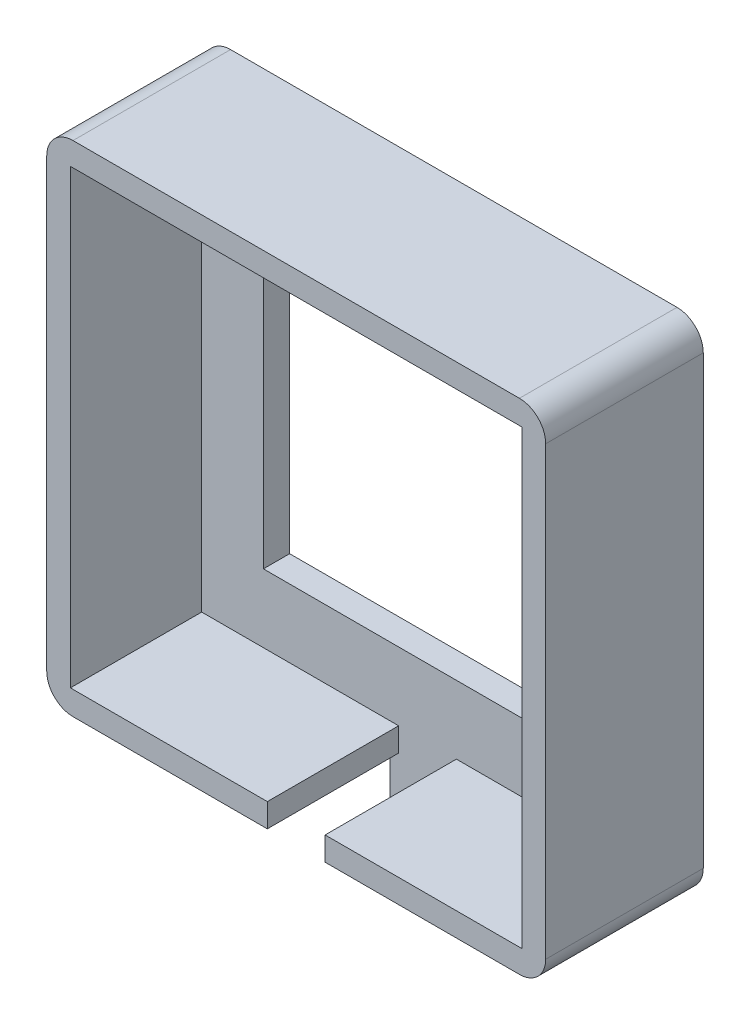
ISO-10303-21;
HEADER;
FILE_DESCRIPTION(('STEP AP214'),'2;1');
FILE_NAME('part.step','',(''),(''),'','','');
FILE_SCHEMA(('AUTOMOTIVE_DESIGN { 1 0 10303 214 1 1 1 1 }'));
ENDSEC;
DATA;
#1=APPLICATION_CONTEXT('core data for automotive mechanical design processes');
#2=APPLICATION_PROTOCOL_DEFINITION('international standard','automotive_design',2000,#1);
#3=PRODUCT_CONTEXT('',#1,'mechanical');
#4=PRODUCT('Part','Part','',(#3));
#5=PRODUCT_RELATED_PRODUCT_CATEGORY('part','',(#4));
#6=PRODUCT_DEFINITION_FORMATION('','',#4);
#7=PRODUCT_DEFINITION_CONTEXT('part definition',#1,'design');
#8=PRODUCT_DEFINITION('design','',#6,#7);
#9=PRODUCT_DEFINITION_SHAPE('','',#8);
#10=(LENGTH_UNIT() NAMED_UNIT(*) SI_UNIT(.MILLI.,.METRE.));
#11=(NAMED_UNIT(*) PLANE_ANGLE_UNIT() SI_UNIT($,.RADIAN.));
#12=(NAMED_UNIT(*) SI_UNIT($,.STERADIAN.) SOLID_ANGLE_UNIT());
#13=UNCERTAINTY_MEASURE_WITH_UNIT(LENGTH_MEASURE(1.E-05),#10,'distance_accuracy_value','');
#14=(GEOMETRIC_REPRESENTATION_CONTEXT(3) GLOBAL_UNCERTAINTY_ASSIGNED_CONTEXT((#13)) GLOBAL_UNIT_ASSIGNED_CONTEXT((#10,
#11,#12)) REPRESENTATION_CONTEXT('',''));
#15=CARTESIAN_POINT('',(0.,0.,0.));
#16=DIRECTION('',(0.,0.,1.));
#17=DIRECTION('',(1.,0.,0.));
#18=AXIS2_PLACEMENT_3D('',#15,#16,#17);
#19=CARTESIAN_POINT('',(-24.018947996006,-15.2573855243722,2.));
#20=DIRECTION('',(0.,1.,0.));
#21=DIRECTION('',(0.,0.,1.));
#22=AXIS2_PLACEMENT_3D('',#19,#20,#21);
#23=PLANE('',#22);
#24=DIRECTION('',(1.,0.,0.));
#25=VECTOR('',#24,1.);
#26=CARTESIAN_POINT('',(-2.14249889150364,-15.2573855243722,2.));
#27=LINE('',#26,#25);
#28=CARTESIAN_POINT('',(-2.81894799600603,-15.2573855243722,2.));
#29=VERTEX_POINT('',#28);
#30=CARTESIAN_POINT('',(-2.14249889150364,-15.2573855243722,2.));
#31=VERTEX_POINT('',#30);
#32=EDGE_CURVE('E50',#29,#31,#27,.T.);
#33=ORIENTED_EDGE('',*,*,#32,.T.);
#34=DIRECTION('',(0.,0.,-1.));
#35=VECTOR('',#34,1.);
#36=CARTESIAN_POINT('',(-2.14249889150364,-15.2573855243722,2.));
#37=LINE('',#36,#35);
#38=CARTESIAN_POINT('',(-2.14249889150364,-15.2573855243722,0.));
#39=VERTEX_POINT('',#38);
#40=EDGE_CURVE('E209',#31,#39,#37,.T.);
#41=ORIENTED_EDGE('',*,*,#40,.T.);
#42=DIRECTION('',(1.,0.,0.));
#43=VECTOR('',#42,1.);
#44=CARTESIAN_POINT('',(-24.018947996006,-15.2573855243722,0.));
#45=LINE('',#44,#43);
#46=CARTESIAN_POINT('',(11.981052003994,-15.2573855243722,0.));
#47=VERTEX_POINT('',#46);
#48=EDGE_CURVE('E405',#39,#47,#45,.T.);
#49=ORIENTED_EDGE('',*,*,#48,.T.);
#50=DIRECTION('',(0.,0.,-1.));
#51=VECTOR('',#50,1.);
#52=CARTESIAN_POINT('',(11.981052003994,-15.2573855243722,2.));
#53=LINE('',#52,#51);
#54=CARTESIAN_POINT('',(11.981052003994,-15.2573855243722,12.));
#55=VERTEX_POINT('',#54);
#56=EDGE_CURVE('E297',#47,#55,#53,.F.);
#57=ORIENTED_EDGE('',*,*,#56,.T.);
#58=DIRECTION('',(1.,0.,0.));
#59=VECTOR('',#58,1.);
#60=CARTESIAN_POINT('',(13.981052003994,-15.2573855243722,12.));
#61=LINE('',#60,#59);
#62=CARTESIAN_POINT('',(-2.81894799600603,-15.2573855243722,12.));
#63=VERTEX_POINT('',#62);
#64=EDGE_CURVE('E260',#63,#55,#61,.T.);
#65=ORIENTED_EDGE('',*,*,#64,.F.);
#66=DIRECTION('',(0.,0.,-1.));
#67=VECTOR('',#66,1.);
#68=CARTESIAN_POINT('',(-2.81894799600603,-15.2573855243722,12.));
#69=LINE('',#68,#67);
#70=EDGE_CURVE('E269',#63,#29,#69,.T.);
#71=ORIENTED_EDGE('',*,*,#70,.T.);
#72=EDGE_LOOP('',(#33,#41,#49,#57,#65,#71));
#73=FACE_BOUND('',#72,.T.);
#74=ADVANCED_FACE('F35',(#73),#23,.F.);
#75=CARTESIAN_POINT('',(0.,0.,2.));
#76=DIRECTION('',(0.,0.,1.));
#77=DIRECTION('',(1.,0.,0.));
#78=AXIS2_PLACEMENT_3D('',#75,#76,#77);
#79=PLANE('',#78);
#80=DIRECTION('',(0.,-1.,0.));
#81=VECTOR('',#80,1.);
#82=CARTESIAN_POINT('',(-2.81894799600603,-15.2573855243722,2.));
#83=LINE('',#82,#81);
#84=CARTESIAN_POINT('',(-2.81894799600604,-13.4573855243722,2.));
#85=VERTEX_POINT('',#84);
#86=EDGE_CURVE('E244',#85,#29,#83,.T.);
#87=ORIENTED_EDGE('',*,*,#86,.F.);
#88=DIRECTION('',(-1.,0.,0.));
#89=VECTOR('',#88,1.);
#90=CARTESIAN_POINT('',(-2.81894799600604,-13.4573855243722,2.));
#91=LINE('',#90,#89);
#92=CARTESIAN_POINT('',(12.181052003994,-13.4573855243722,2.));
#93=VERTEX_POINT('',#92);
#94=EDGE_CURVE('E282',#93,#85,#91,.T.);
#95=ORIENTED_EDGE('',*,*,#94,.F.);
#96=DIRECTION('',(0.,-1.,0.));
#97=VECTOR('',#96,1.);
#98=CARTESIAN_POINT('',(12.181052003994,-13.4573855243722,2.));
#99=LINE('',#98,#97);
#100=CARTESIAN_POINT('',(12.181052003994,20.9426144756278,2.));
#101=VERTEX_POINT('',#100);
#102=EDGE_CURVE('E279',#101,#93,#99,.T.);
#103=ORIENTED_EDGE('',*,*,#102,.F.);
#104=DIRECTION('',(1.,0.,0.));
#105=VECTOR('',#104,1.);
#106=CARTESIAN_POINT('',(12.181052003994,20.9426144756278,2.));
#107=LINE('',#106,#105);
#108=CARTESIAN_POINT('',(-22.218947996006,20.9426144756278,2.));
#109=VERTEX_POINT('',#108);
#110=EDGE_CURVE('E276',#109,#101,#107,.T.);
#111=ORIENTED_EDGE('',*,*,#110,.F.);
#112=DIRECTION('',(0.,1.,0.));
#113=VECTOR('',#112,1.);
#114=CARTESIAN_POINT('',(-22.218947996006,20.9426144756278,2.));
#115=LINE('',#114,#113);
#116=CARTESIAN_POINT('',(-22.218947996006,-13.4573855243722,2.));
#117=VERTEX_POINT('',#116);
#118=EDGE_CURVE('E273',#117,#109,#115,.T.);
#119=ORIENTED_EDGE('',*,*,#118,.F.);
#120=DIRECTION('',(-1.,0.,0.));
#121=VECTOR('',#120,1.);
#122=CARTESIAN_POINT('',(-22.218947996006,-13.4573855243722,2.));
#123=LINE('',#122,#121);
#124=CARTESIAN_POINT('',(-7.21894799600604,-13.4573855243722,2.));
#125=VERTEX_POINT('',#124);
#126=EDGE_CURVE('E270',#125,#117,#123,.T.);
#127=ORIENTED_EDGE('',*,*,#126,.F.);
#128=DIRECTION('',(0.,1.,0.));
#129=VECTOR('',#128,1.);
#130=CARTESIAN_POINT('',(-7.21894799600604,-13.4573855243722,2.));
#131=LINE('',#130,#129);
#132=CARTESIAN_POINT('',(-7.21894799600604,-15.2573855243722,2.));
#133=VERTEX_POINT('',#132);
#134=EDGE_CURVE('E236',#133,#125,#131,.T.);
#135=ORIENTED_EDGE('',*,*,#134,.F.);
#136=CARTESIAN_POINT('',(-7.89539710050843,-15.2573855243722,2.));
#137=VERTEX_POINT('',#136);
#138=EDGE_CURVE('E220',#137,#133,#27,.T.);
#139=ORIENTED_EDGE('',*,*,#138,.F.);
#140=DIRECTION('',(0.,1.,0.));
#141=VECTOR('',#140,1.);
#142=CARTESIAN_POINT('',(-7.89539710050844,-19.2573855243722,2.));
#143=LINE('',#142,#141);
#144=CARTESIAN_POINT('',(-7.89539710050844,-19.2573855243722,2.));
#145=VERTEX_POINT('',#144);
#146=EDGE_CURVE('E217',#145,#137,#143,.T.);
#147=ORIENTED_EDGE('',*,*,#146,.F.);
#148=CARTESIAN_POINT('',(-5.01894799600604,-19.2573855243722,2.));
#149=DIRECTION('',(0.,0.,-1.));
#150=DIRECTION('',(-1.,0.,0.));
#151=AXIS2_PLACEMENT_3D('',#148,#149,#150);
#152=CIRCLE('',#151,2.8764491045024);
#153=CARTESIAN_POINT('',(-2.14249889150364,-19.2573855243722,2.));
#154=VERTEX_POINT('',#153);
#155=EDGE_CURVE('E200',#154,#145,#152,.T.);
#156=ORIENTED_EDGE('',*,*,#155,.F.);
#157=DIRECTION('',(0.,-1.,0.));
#158=VECTOR('',#157,1.);
#159=CARTESIAN_POINT('',(-2.14249889150364,-15.2573855243722,2.));
#160=LINE('',#159,#158);
#161=EDGE_CURVE('E215',#31,#154,#160,.T.);
#162=ORIENTED_EDGE('',*,*,#161,.F.);
#163=ORIENTED_EDGE('',*,*,#32,.F.);
#164=EDGE_LOOP('',(#87,#95,#103,#111,#119,#127,#135,#139,#147,#156,#162,#163));
#165=FACE_BOUND('',#164,.T.);
#166=DIRECTION('',(1.,0.,0.));
#167=VECTOR('',#166,1.);
#168=CARTESIAN_POINT('',(-17.518947996006,-8.25738552437222,2.));
#169=LINE('',#168,#167);
#170=CARTESIAN_POINT('',(-17.518947996006,-8.25738552437222,2.));
#171=VERTEX_POINT('',#170);
#172=CARTESIAN_POINT('',(7.48105200399396,-8.25738552437222,2.));
#173=VERTEX_POINT('',#172);
#174=EDGE_CURVE('E378',#171,#173,#169,.T.);
#175=ORIENTED_EDGE('',*,*,#174,.F.);
#176=DIRECTION('',(0.,-1.,0.));
#177=VECTOR('',#176,1.);
#178=CARTESIAN_POINT('',(-17.518947996006,16.7426144756278,2.));
#179=LINE('',#178,#177);
#180=CARTESIAN_POINT('',(-17.518947996006,16.7426144756278,2.));
#181=VERTEX_POINT('',#180);
#182=EDGE_CURVE('E376',#181,#171,#179,.T.);
#183=ORIENTED_EDGE('',*,*,#182,.F.);
#184=DIRECTION('',(-1.,0.,0.));
#185=VECTOR('',#184,1.);
#186=CARTESIAN_POINT('',(-17.518947996006,16.7426144756278,2.));
#187=LINE('',#186,#185);
#188=CARTESIAN_POINT('',(7.48105200399396,16.7426144756278,2.));
#189=VERTEX_POINT('',#188);
#190=EDGE_CURVE('E384',#189,#181,#187,.T.);
#191=ORIENTED_EDGE('',*,*,#190,.F.);
#192=DIRECTION('',(0.,1.,0.));
#193=VECTOR('',#192,1.);
#194=CARTESIAN_POINT('',(7.48105200399396,16.7426144756278,2.));
#195=LINE('',#194,#193);
#196=EDGE_CURVE('E381',#173,#189,#195,.T.);
#197=ORIENTED_EDGE('',*,*,#196,.F.);
#198=EDGE_LOOP('',(#175,#183,#191,#197));
#199=FACE_BOUND('',#198,.T.);
#200=CARTESIAN_POINT('',(-5.01894799600604,-19.2573855243722,2.));
#201=DIRECTION('',(0.,0.,-1.));
#202=DIRECTION('',(-1.,0.,0.));
#203=AXIS2_PLACEMENT_3D('',#200,#201,#202);
#204=CIRCLE('',#203,1.);
#205=CARTESIAN_POINT('',(-6.01894799600604,-19.2573855243722,2.));
#206=VERTEX_POINT('',#205);
#207=EDGE_CURVE('E230',#206,#206,#204,.T.);
#208=ORIENTED_EDGE('',*,*,#207,.T.);
#209=EDGE_LOOP('',(#208));
#210=FACE_BOUND('',#209,.T.);
#211=ADVANCED_FACE('F213',(#165,#199,#210),#79,.T.);
#212=CARTESIAN_POINT('',(0.,0.,0.));
#213=DIRECTION('',(0.,0.,1.));
#214=DIRECTION('',(1.,0.,0.));
#215=AXIS2_PLACEMENT_3D('',#212,#213,#214);
#216=PLANE('',#215);
#217=CARTESIAN_POINT('',(-22.018947996006,-15.2573855243722,0.));
#218=VERTEX_POINT('',#217);
#219=CARTESIAN_POINT('',(-7.89539710050843,-15.2573855243722,0.));
#220=VERTEX_POINT('',#219);
#221=EDGE_CURVE('E348',#218,#220,#45,.T.);
#222=ORIENTED_EDGE('',*,*,#221,.F.);
#223=CARTESIAN_POINT('',(-22.018947996006,-13.2573855243722,0.));
#224=DIRECTION('',(0.,0.,1.));
#225=DIRECTION('',(1.,0.,0.));
#226=AXIS2_PLACEMENT_3D('',#223,#224,#225);
#227=CIRCLE('',#226,2.);
#228=CARTESIAN_POINT('',(-24.018947996006,-13.2573855243722,0.));
#229=VERTEX_POINT('',#228);
#230=EDGE_CURVE('E310',#218,#229,#227,.F.);
#231=ORIENTED_EDGE('',*,*,#230,.T.);
#232=DIRECTION('',(0.,-1.,0.));
#233=VECTOR('',#232,1.);
#234=CARTESIAN_POINT('',(-24.018947996006,22.7426144756278,0.));
#235=LINE('',#234,#233);
#236=CARTESIAN_POINT('',(-24.018947996006,20.7426144756278,0.));
#237=VERTEX_POINT('',#236);
#238=EDGE_CURVE('E403',#237,#229,#235,.T.);
#239=ORIENTED_EDGE('',*,*,#238,.F.);
#240=CARTESIAN_POINT('',(-22.018947996006,20.7426144756278,0.));
#241=DIRECTION('',(0.,0.,1.));
#242=DIRECTION('',(1.,0.,0.));
#243=AXIS2_PLACEMENT_3D('',#240,#241,#242);
#244=CIRCLE('',#243,2.);
#245=CARTESIAN_POINT('',(-22.018947996006,22.7426144756278,0.));
#246=VERTEX_POINT('',#245);
#247=EDGE_CURVE('E305',#237,#246,#244,.F.);
#248=ORIENTED_EDGE('',*,*,#247,.T.);
#249=DIRECTION('',(-1.,0.,0.));
#250=VECTOR('',#249,1.);
#251=CARTESIAN_POINT('',(-24.018947996006,22.7426144756278,0.));
#252=LINE('',#251,#250);
#253=CARTESIAN_POINT('',(11.981052003994,22.7426144756278,0.));
#254=VERTEX_POINT('',#253);
#255=EDGE_CURVE('E300',#254,#246,#252,.T.);
#256=ORIENTED_EDGE('',*,*,#255,.F.);
#257=CARTESIAN_POINT('',(11.981052003994,20.7426144756278,0.));
#258=DIRECTION('',(0.,0.,1.));
#259=DIRECTION('',(1.,0.,0.));
#260=AXIS2_PLACEMENT_3D('',#257,#258,#259);
#261=CIRCLE('',#260,2.);
#262=CARTESIAN_POINT('',(13.981052003994,20.7426144756278,0.));
#263=VERTEX_POINT('',#262);
#264=EDGE_CURVE('E303',#254,#263,#261,.F.);
#265=ORIENTED_EDGE('',*,*,#264,.T.);
#266=DIRECTION('',(0.,1.,0.));
#267=VECTOR('',#266,1.);
#268=CARTESIAN_POINT('',(13.981052003994,22.7426144756278,0.));
#269=LINE('',#268,#267);
#270=CARTESIAN_POINT('',(13.981052003994,-13.2573855243722,0.));
#271=VERTEX_POINT('',#270);
#272=EDGE_CURVE('E346',#271,#263,#269,.T.);
#273=ORIENTED_EDGE('',*,*,#272,.F.);
#274=CARTESIAN_POINT('',(11.981052003994,-13.2573855243722,0.));
#275=DIRECTION('',(0.,0.,1.));
#276=DIRECTION('',(1.,0.,0.));
#277=AXIS2_PLACEMENT_3D('',#274,#275,#276);
#278=CIRCLE('',#277,2.);
#279=EDGE_CURVE('E307',#271,#47,#278,.F.);
#280=ORIENTED_EDGE('',*,*,#279,.T.);
#281=ORIENTED_EDGE('',*,*,#48,.F.);
#282=DIRECTION('',(0.,-1.,0.));
#283=VECTOR('',#282,1.);
#284=CARTESIAN_POINT('',(-2.14249889150364,-15.2573855243722,0.));
#285=LINE('',#284,#283);
#286=CARTESIAN_POINT('',(-2.14249889150364,-19.2573855243722,0.));
#287=VERTEX_POINT('',#286);
#288=EDGE_CURVE('E228',#39,#287,#285,.T.);
#289=ORIENTED_EDGE('',*,*,#288,.T.);
#290=CARTESIAN_POINT('',(-5.01894799600604,-19.2573855243722,0.));
#291=DIRECTION('',(0.,0.,-1.));
#292=DIRECTION('',(-1.,0.,0.));
#293=AXIS2_PLACEMENT_3D('',#290,#291,#292);
#294=CIRCLE('',#293,2.8764491045024);
#295=CARTESIAN_POINT('',(-7.89539710050844,-19.2573855243722,0.));
#296=VERTEX_POINT('',#295);
#297=EDGE_CURVE('E203',#287,#296,#294,.T.);
#298=ORIENTED_EDGE('',*,*,#297,.T.);
#299=DIRECTION('',(0.,1.,0.));
#300=VECTOR('',#299,1.);
#301=CARTESIAN_POINT('',(-7.89539710050844,-19.2573855243722,0.));
#302=LINE('',#301,#300);
#303=EDGE_CURVE('E232',#296,#220,#302,.T.);
#304=ORIENTED_EDGE('',*,*,#303,.T.);
#305=EDGE_LOOP('',(#222,#231,#239,#248,#256,#265,#273,#280,#281,#289,#298,#304));
#306=FACE_BOUND('',#305,.T.);
#307=DIRECTION('',(0.,-1.,0.));
#308=VECTOR('',#307,1.);
#309=CARTESIAN_POINT('',(-17.518947996006,16.7426144756278,0.));
#310=LINE('',#309,#308);
#311=CARTESIAN_POINT('',(-17.518947996006,16.7426144756278,0.));
#312=VERTEX_POINT('',#311);
#313=CARTESIAN_POINT('',(-17.518947996006,-8.25738552437222,0.));
#314=VERTEX_POINT('',#313);
#315=EDGE_CURVE('E357',#312,#314,#310,.T.);
#316=ORIENTED_EDGE('',*,*,#315,.T.);
#317=DIRECTION('',(1.,0.,0.));
#318=VECTOR('',#317,1.);
#319=CARTESIAN_POINT('',(-17.518947996006,-8.25738552437222,0.));
#320=LINE('',#319,#318);
#321=CARTESIAN_POINT('',(7.48105200399396,-8.25738552437222,0.));
#322=VERTEX_POINT('',#321);
#323=EDGE_CURVE('E363',#314,#322,#320,.T.);
#324=ORIENTED_EDGE('',*,*,#323,.T.);
#325=DIRECTION('',(0.,1.,0.));
#326=VECTOR('',#325,1.);
#327=CARTESIAN_POINT('',(7.48105200399396,16.7426144756278,0.));
#328=LINE('',#327,#326);
#329=CARTESIAN_POINT('',(7.48105200399396,16.7426144756278,0.));
#330=VERTEX_POINT('',#329);
#331=EDGE_CURVE('E389',#322,#330,#328,.T.);
#332=ORIENTED_EDGE('',*,*,#331,.T.);
#333=DIRECTION('',(-1.,0.,0.));
#334=VECTOR('',#333,1.);
#335=CARTESIAN_POINT('',(-17.518947996006,16.7426144756278,0.));
#336=LINE('',#335,#334);
#337=EDGE_CURVE('E379',#330,#312,#336,.T.);
#338=ORIENTED_EDGE('',*,*,#337,.T.);
#339=EDGE_LOOP('',(#316,#324,#332,#338));
#340=FACE_BOUND('',#339,.T.);
#341=CARTESIAN_POINT('',(-5.01894799600604,-19.2573855243722,0.));
#342=DIRECTION('',(0.,0.,-1.));
#343=DIRECTION('',(-1.,0.,0.));
#344=AXIS2_PLACEMENT_3D('',#341,#342,#343);
#345=CIRCLE('',#344,1.);
#346=CARTESIAN_POINT('',(-6.01894799600604,-19.2573855243722,0.));
#347=VERTEX_POINT('',#346);
#348=EDGE_CURVE('E563',#347,#347,#345,.T.);
#349=ORIENTED_EDGE('',*,*,#348,.F.);
#350=EDGE_LOOP('',(#349));
#351=FACE_BOUND('',#350,.T.);
#352=ADVANCED_FACE('F341',(#306,#340,#351),#216,.F.);
#353=CARTESIAN_POINT('',(-24.018947996006,22.7426144756278,2.));
#354=DIRECTION('',(1.,0.,0.));
#355=DIRECTION('',(0.,1.,0.));
#356=AXIS2_PLACEMENT_3D('',#353,#354,#355);
#357=PLANE('',#356);
#358=ORIENTED_EDGE('',*,*,#238,.T.);
#359=DIRECTION('',(0.,0.,-1.));
#360=VECTOR('',#359,1.);
#361=CARTESIAN_POINT('',(-24.018947996006,-13.2573855243722,2.));
#362=LINE('',#361,#360);
#363=CARTESIAN_POINT('',(-24.018947996006,-13.2573855243722,12.));
#364=VERTEX_POINT('',#363);
#365=EDGE_CURVE('E315',#229,#364,#362,.F.);
#366=ORIENTED_EDGE('',*,*,#365,.T.);
#367=DIRECTION('',(0.,-1.,0.));
#368=VECTOR('',#367,1.);
#369=CARTESIAN_POINT('',(-24.018947996006,-15.2573855243722,12.));
#370=LINE('',#369,#368);
#371=CARTESIAN_POINT('',(-24.018947996006,20.7426144756278,12.));
#372=VERTEX_POINT('',#371);
#373=EDGE_CURVE('E240',#372,#364,#370,.T.);
#374=ORIENTED_EDGE('',*,*,#373,.F.);
#375=DIRECTION('',(0.,0.,-1.));
#376=VECTOR('',#375,1.);
#377=CARTESIAN_POINT('',(-24.018947996006,20.7426144756278,2.));
#378=LINE('',#377,#376);
#379=EDGE_CURVE('E312',#372,#237,#378,.T.);
#380=ORIENTED_EDGE('',*,*,#379,.T.);
#381=EDGE_LOOP('',(#358,#366,#374,#380));
#382=FACE_BOUND('',#381,.T.);
#383=ADVANCED_FACE('F424',(#382),#357,.F.);
#384=ORIENTED_EDGE('',*,*,#221,.T.);
#385=DIRECTION('',(0.,0.,-1.));
#386=VECTOR('',#385,1.);
#387=CARTESIAN_POINT('',(-7.89539710050844,-15.2573855243722,2.));
#388=LINE('',#387,#386);
#389=EDGE_CURVE('E58',#137,#220,#388,.T.);
#390=ORIENTED_EDGE('',*,*,#389,.F.);
#391=ORIENTED_EDGE('',*,*,#138,.T.);
#392=DIRECTION('',(0.,0.,-1.));
#393=VECTOR('',#392,1.);
#394=CARTESIAN_POINT('',(-7.21894799600604,-15.2573855243722,12.));
#395=LINE('',#394,#393);
#396=CARTESIAN_POINT('',(-7.21894799600604,-15.2573855243722,12.));
#397=VERTEX_POINT('',#396);
#398=EDGE_CURVE('E355',#397,#133,#395,.T.);
#399=ORIENTED_EDGE('',*,*,#398,.F.);
#400=DIRECTION('',(1.,0.,0.));
#401=VECTOR('',#400,1.);
#402=CARTESIAN_POINT('',(-7.21894799600604,-15.2573855243722,12.));
#403=LINE('',#402,#401);
#404=CARTESIAN_POINT('',(-22.018947996006,-15.2573855243722,12.));
#405=VERTEX_POINT('',#404);
#406=EDGE_CURVE('E243',#405,#397,#403,.T.);
#407=ORIENTED_EDGE('',*,*,#406,.F.);
#408=DIRECTION('',(0.,0.,-1.));
#409=VECTOR('',#408,1.);
#410=CARTESIAN_POINT('',(-22.018947996006,-15.2573855243722,2.));
#411=LINE('',#410,#409);
#412=EDGE_CURVE('E299',#405,#218,#411,.T.);
#413=ORIENTED_EDGE('',*,*,#412,.T.);
#414=EDGE_LOOP('',(#384,#390,#391,#399,#407,#413));
#415=FACE_BOUND('',#414,.T.);
#416=ADVANCED_FACE('F431',(#415),#23,.F.);
#417=CARTESIAN_POINT('',(13.981052003994,22.7426144756278,2.));
#418=DIRECTION('',(-1.,0.,0.));
#419=DIRECTION('',(0.,-1.,0.));
#420=AXIS2_PLACEMENT_3D('',#417,#418,#419);
#421=PLANE('',#420);
#422=DIRECTION('',(0.,1.,0.));
#423=VECTOR('',#422,1.);
#424=CARTESIAN_POINT('',(13.981052003994,22.7426144756278,12.));
#425=LINE('',#424,#423);
#426=CARTESIAN_POINT('',(13.981052003994,-13.2573855243722,12.));
#427=VERTEX_POINT('',#426);
#428=CARTESIAN_POINT('',(13.981052003994,20.7426144756278,12.));
#429=VERTEX_POINT('',#428);
#430=EDGE_CURVE('E263',#427,#429,#425,.T.);
#431=ORIENTED_EDGE('',*,*,#430,.F.);
#432=DIRECTION('',(0.,0.,-1.));
#433=VECTOR('',#432,1.);
#434=CARTESIAN_POINT('',(13.981052003994,-13.2573855243722,2.));
#435=LINE('',#434,#433);
#436=EDGE_CURVE('E327',#427,#271,#435,.T.);
#437=ORIENTED_EDGE('',*,*,#436,.T.);
#438=ORIENTED_EDGE('',*,*,#272,.T.);
#439=DIRECTION('',(0.,0.,-1.));
#440=VECTOR('',#439,1.);
#441=CARTESIAN_POINT('',(13.981052003994,20.7426144756278,2.));
#442=LINE('',#441,#440);
#443=EDGE_CURVE('E325',#263,#429,#442,.F.);
#444=ORIENTED_EDGE('',*,*,#443,.T.);
#445=EDGE_LOOP('',(#431,#437,#438,#444));
#446=FACE_BOUND('',#445,.T.);
#447=ADVANCED_FACE('F416',(#446),#421,.F.);
#448=CARTESIAN_POINT('',(-24.018947996006,22.7426144756278,2.));
#449=DIRECTION('',(0.,-1.,0.));
#450=DIRECTION('',(0.,0.,-1.));
#451=AXIS2_PLACEMENT_3D('',#448,#449,#450);
#452=PLANE('',#451);
#453=ORIENTED_EDGE('',*,*,#255,.T.);
#454=DIRECTION('',(0.,0.,-1.));
#455=VECTOR('',#454,1.);
#456=CARTESIAN_POINT('',(-22.018947996006,22.7426144756278,2.));
#457=LINE('',#456,#455);
#458=CARTESIAN_POINT('',(-22.018947996006,22.7426144756278,12.));
#459=VERTEX_POINT('',#458);
#460=EDGE_CURVE('E11',#246,#459,#457,.F.);
#461=ORIENTED_EDGE('',*,*,#460,.T.);
#462=DIRECTION('',(-1.,0.,0.));
#463=VECTOR('',#462,1.);
#464=CARTESIAN_POINT('',(-24.018947996006,22.7426144756278,12.));
#465=LINE('',#464,#463);
#466=CARTESIAN_POINT('',(11.981052003994,22.7426144756278,12.));
#467=VERTEX_POINT('',#466);
#468=EDGE_CURVE('E266',#467,#459,#465,.T.);
#469=ORIENTED_EDGE('',*,*,#468,.F.);
#470=DIRECTION('',(0.,0.,-1.));
#471=VECTOR('',#470,1.);
#472=CARTESIAN_POINT('',(11.981052003994,22.7426144756278,2.));
#473=LINE('',#472,#471);
#474=EDGE_CURVE('E43',#467,#254,#473,.T.);
#475=ORIENTED_EDGE('',*,*,#474,.T.);
#476=EDGE_LOOP('',(#453,#461,#469,#475));
#477=FACE_BOUND('',#476,.T.);
#478=ADVANCED_FACE('F335',(#477),#452,.F.);
#479=CARTESIAN_POINT('',(-17.518947996006,16.7426144756278,2.));
#480=DIRECTION('',(1.,0.,0.));
#481=DIRECTION('',(0.,1.,0.));
#482=AXIS2_PLACEMENT_3D('',#479,#480,#481);
#483=PLANE('',#482);
#484=ORIENTED_EDGE('',*,*,#315,.F.);
#485=DIRECTION('',(0.,0.,-1.));
#486=VECTOR('',#485,1.);
#487=CARTESIAN_POINT('',(-17.518947996006,16.7426144756278,2.));
#488=LINE('',#487,#486);
#489=EDGE_CURVE('E385',#181,#312,#488,.T.);
#490=ORIENTED_EDGE('',*,*,#489,.F.);
#491=ORIENTED_EDGE('',*,*,#182,.T.);
#492=DIRECTION('',(0.,0.,-1.));
#493=VECTOR('',#492,1.);
#494=CARTESIAN_POINT('',(-17.518947996006,-8.25738552437222,2.));
#495=LINE('',#494,#493);
#496=EDGE_CURVE('E400',#171,#314,#495,.T.);
#497=ORIENTED_EDGE('',*,*,#496,.T.);
#498=EDGE_LOOP('',(#484,#490,#491,#497));
#499=FACE_BOUND('',#498,.T.);
#500=ADVANCED_FACE('F593',(#499),#483,.T.);
#501=CARTESIAN_POINT('',(-17.518947996006,-8.25738552437222,2.));
#502=DIRECTION('',(0.,1.,0.));
#503=DIRECTION('',(0.,0.,1.));
#504=AXIS2_PLACEMENT_3D('',#501,#502,#503);
#505=PLANE('',#504);
#506=ORIENTED_EDGE('',*,*,#323,.F.);
#507=ORIENTED_EDGE('',*,*,#496,.F.);
#508=ORIENTED_EDGE('',*,*,#174,.T.);
#509=DIRECTION('',(0.,0.,-1.));
#510=VECTOR('',#509,1.);
#511=CARTESIAN_POINT('',(7.48105200399396,-8.25738552437222,2.));
#512=LINE('',#511,#510);
#513=EDGE_CURVE('E398',#173,#322,#512,.T.);
#514=ORIENTED_EDGE('',*,*,#513,.T.);
#515=EDGE_LOOP('',(#506,#507,#508,#514));
#516=FACE_BOUND('',#515,.T.);
#517=ADVANCED_FACE('F589',(#516),#505,.T.);
#518=CARTESIAN_POINT('',(7.48105200399396,16.7426144756278,2.));
#519=DIRECTION('',(-1.,0.,0.));
#520=DIRECTION('',(0.,-1.,0.));
#521=AXIS2_PLACEMENT_3D('',#518,#519,#520);
#522=PLANE('',#521);
#523=ORIENTED_EDGE('',*,*,#331,.F.);
#524=ORIENTED_EDGE('',*,*,#513,.F.);
#525=ORIENTED_EDGE('',*,*,#196,.T.);
#526=DIRECTION('',(0.,0.,-1.));
#527=VECTOR('',#526,1.);
#528=CARTESIAN_POINT('',(7.48105200399396,16.7426144756278,2.));
#529=LINE('',#528,#527);
#530=EDGE_CURVE('E396',#189,#330,#529,.T.);
#531=ORIENTED_EDGE('',*,*,#530,.T.);
#532=EDGE_LOOP('',(#523,#524,#525,#531));
#533=FACE_BOUND('',#532,.T.);
#534=ADVANCED_FACE('F585',(#533),#522,.T.);
#535=CARTESIAN_POINT('',(-17.518947996006,16.7426144756278,2.));
#536=DIRECTION('',(0.,-1.,0.));
#537=DIRECTION('',(0.,0.,-1.));
#538=AXIS2_PLACEMENT_3D('',#535,#536,#537);
#539=PLANE('',#538);
#540=ORIENTED_EDGE('',*,*,#337,.F.);
#541=ORIENTED_EDGE('',*,*,#530,.F.);
#542=ORIENTED_EDGE('',*,*,#190,.T.);
#543=ORIENTED_EDGE('',*,*,#489,.T.);
#544=EDGE_LOOP('',(#540,#541,#542,#543));
#545=FACE_BOUND('',#544,.T.);
#546=ADVANCED_FACE('F582',(#545),#539,.T.);
#547=CARTESIAN_POINT('',(-7.21894799600604,-13.4573855243722,12.));
#548=DIRECTION('',(-1.,0.,0.));
#549=DIRECTION('',(0.,0.,1.));
#550=AXIS2_PLACEMENT_3D('',#547,#548,#549);
#551=PLANE('',#550);
#552=ORIENTED_EDGE('',*,*,#134,.T.);
#553=DIRECTION('',(0.,0.,-1.));
#554=VECTOR('',#553,1.);
#555=CARTESIAN_POINT('',(-7.21894799600604,-13.4573855243722,12.));
#556=LINE('',#555,#554);
#557=CARTESIAN_POINT('',(-7.21894799600604,-13.4573855243722,12.));
#558=VERTEX_POINT('',#557);
#559=EDGE_CURVE('E358',#558,#125,#556,.T.);
#560=ORIENTED_EDGE('',*,*,#559,.F.);
#561=DIRECTION('',(0.,1.,0.));
#562=VECTOR('',#561,1.);
#563=CARTESIAN_POINT('',(-7.21894799600604,-13.4573855243722,12.));
#564=LINE('',#563,#562);
#565=EDGE_CURVE('E246',#397,#558,#564,.T.);
#566=ORIENTED_EDGE('',*,*,#565,.F.);
#567=ORIENTED_EDGE('',*,*,#398,.T.);
#568=EDGE_LOOP('',(#552,#560,#566,#567));
#569=FACE_BOUND('',#568,.T.);
#570=ADVANCED_FACE('F433',(#569),#551,.F.);
#571=CARTESIAN_POINT('',(-22.218947996006,-13.4573855243722,12.));
#572=DIRECTION('',(0.,-1.,0.));
#573=DIRECTION('',(1.,0.,0.));
#574=AXIS2_PLACEMENT_3D('',#571,#572,#573);
#575=PLANE('',#574);
#576=ORIENTED_EDGE('',*,*,#126,.T.);
#577=DIRECTION('',(0.,0.,-1.));
#578=VECTOR('',#577,1.);
#579=CARTESIAN_POINT('',(-22.218947996006,-13.4573855243722,12.));
#580=LINE('',#579,#578);
#581=CARTESIAN_POINT('',(-22.218947996006,-13.4573855243722,12.));
#582=VERTEX_POINT('',#581);
#583=EDGE_CURVE('E366',#582,#117,#580,.T.);
#584=ORIENTED_EDGE('',*,*,#583,.F.);
#585=DIRECTION('',(-1.,0.,0.));
#586=VECTOR('',#585,1.);
#587=CARTESIAN_POINT('',(-22.218947996006,-13.4573855243722,12.));
#588=LINE('',#587,#586);
#589=EDGE_CURVE('E248',#558,#582,#588,.T.);
#590=ORIENTED_EDGE('',*,*,#589,.F.);
#591=ORIENTED_EDGE('',*,*,#559,.T.);
#592=EDGE_LOOP('',(#576,#584,#590,#591));
#593=FACE_BOUND('',#592,.T.);
#594=ADVANCED_FACE('F435',(#593),#575,.F.);
#595=CARTESIAN_POINT('',(-22.218947996006,20.9426144756278,12.));
#596=DIRECTION('',(-1.,0.,0.));
#597=DIRECTION('',(0.,-1.,0.));
#598=AXIS2_PLACEMENT_3D('',#595,#596,#597);
#599=PLANE('',#598);
#600=ORIENTED_EDGE('',*,*,#118,.T.);
#601=DIRECTION('',(0.,0.,-1.));
#602=VECTOR('',#601,1.);
#603=CARTESIAN_POINT('',(-22.218947996006,20.9426144756278,12.));
#604=LINE('',#603,#602);
#605=CARTESIAN_POINT('',(-22.218947996006,20.9426144756278,12.));
#606=VERTEX_POINT('',#605);
#607=EDGE_CURVE('E372',#606,#109,#604,.T.);
#608=ORIENTED_EDGE('',*,*,#607,.F.);
#609=DIRECTION('',(0.,1.,0.));
#610=VECTOR('',#609,1.);
#611=CARTESIAN_POINT('',(-22.218947996006,20.9426144756278,12.));
#612=LINE('',#611,#610);
#613=EDGE_CURVE('E250',#582,#606,#612,.T.);
#614=ORIENTED_EDGE('',*,*,#613,.F.);
#615=ORIENTED_EDGE('',*,*,#583,.T.);
#616=EDGE_LOOP('',(#600,#608,#614,#615));
#617=FACE_BOUND('',#616,.T.);
#618=ADVANCED_FACE('F439',(#617),#599,.F.);
#619=CARTESIAN_POINT('',(12.181052003994,20.9426144756278,12.));
#620=DIRECTION('',(0.,1.,0.));
#621=DIRECTION('',(-1.,0.,0.));
#622=AXIS2_PLACEMENT_3D('',#619,#620,#621);
#623=PLANE('',#622);
#624=ORIENTED_EDGE('',*,*,#110,.T.);
#625=DIRECTION('',(0.,0.,-1.));
#626=VECTOR('',#625,1.);
#627=CARTESIAN_POINT('',(12.181052003994,20.9426144756278,12.));
#628=LINE('',#627,#626);
#629=CARTESIAN_POINT('',(12.181052003994,20.9426144756278,12.));
#630=VERTEX_POINT('',#629);
#631=EDGE_CURVE('E447',#630,#101,#628,.T.);
#632=ORIENTED_EDGE('',*,*,#631,.F.);
#633=DIRECTION('',(1.,0.,0.));
#634=VECTOR('',#633,1.);
#635=CARTESIAN_POINT('',(12.181052003994,20.9426144756278,12.));
#636=LINE('',#635,#634);
#637=EDGE_CURVE('E252',#606,#630,#636,.T.);
#638=ORIENTED_EDGE('',*,*,#637,.F.);
#639=ORIENTED_EDGE('',*,*,#607,.T.);
#640=EDGE_LOOP('',(#624,#632,#638,#639));
#641=FACE_BOUND('',#640,.T.);
#642=ADVANCED_FACE('F448',(#641),#623,.F.);
#643=CARTESIAN_POINT('',(12.181052003994,-13.4573855243722,12.));
#644=DIRECTION('',(1.,0.,0.));
#645=DIRECTION('',(0.,0.,-1.));
#646=AXIS2_PLACEMENT_3D('',#643,#644,#645);
#647=PLANE('',#646);
#648=ORIENTED_EDGE('',*,*,#102,.T.);
#649=DIRECTION('',(0.,0.,-1.));
#650=VECTOR('',#649,1.);
#651=CARTESIAN_POINT('',(12.181052003994,-13.4573855243722,12.));
#652=LINE('',#651,#650);
#653=CARTESIAN_POINT('',(12.181052003994,-13.4573855243722,12.));
#654=VERTEX_POINT('',#653);
#655=EDGE_CURVE('E450',#654,#93,#652,.T.);
#656=ORIENTED_EDGE('',*,*,#655,.F.);
#657=DIRECTION('',(0.,-1.,0.));
#658=VECTOR('',#657,1.);
#659=CARTESIAN_POINT('',(12.181052003994,-13.4573855243722,12.));
#660=LINE('',#659,#658);
#661=EDGE_CURVE('E254',#630,#654,#660,.T.);
#662=ORIENTED_EDGE('',*,*,#661,.F.);
#663=ORIENTED_EDGE('',*,*,#631,.T.);
#664=EDGE_LOOP('',(#648,#656,#662,#663));
#665=FACE_BOUND('',#664,.T.);
#666=ADVANCED_FACE('F452',(#665),#647,.F.);
#667=CARTESIAN_POINT('',(-2.81894799600604,-13.4573855243722,12.));
#668=DIRECTION('',(0.,-1.,0.));
#669=DIRECTION('',(0.,0.,-1.));
#670=AXIS2_PLACEMENT_3D('',#667,#668,#669);
#671=PLANE('',#670);
#672=ORIENTED_EDGE('',*,*,#94,.T.);
#673=DIRECTION('',(0.,0.,-1.));
#674=VECTOR('',#673,1.);
#675=CARTESIAN_POINT('',(-2.81894799600604,-13.4573855243722,12.));
#676=LINE('',#675,#674);
#677=CARTESIAN_POINT('',(-2.81894799600604,-13.4573855243722,12.));
#678=VERTEX_POINT('',#677);
#679=EDGE_CURVE('E287',#678,#85,#676,.T.);
#680=ORIENTED_EDGE('',*,*,#679,.F.);
#681=DIRECTION('',(-1.,0.,0.));
#682=VECTOR('',#681,1.);
#683=CARTESIAN_POINT('',(-2.81894799600604,-13.4573855243722,12.));
#684=LINE('',#683,#682);
#685=EDGE_CURVE('E256',#654,#678,#684,.T.);
#686=ORIENTED_EDGE('',*,*,#685,.F.);
#687=ORIENTED_EDGE('',*,*,#655,.T.);
#688=EDGE_LOOP('',(#672,#680,#686,#687));
#689=FACE_BOUND('',#688,.T.);
#690=ADVANCED_FACE('F457',(#689),#671,.F.);
#691=CARTESIAN_POINT('',(-2.81894799600603,-15.2573855243722,12.));
#692=DIRECTION('',(1.,0.,0.));
#693=DIRECTION('',(0.,1.,0.));
#694=AXIS2_PLACEMENT_3D('',#691,#692,#693);
#695=PLANE('',#694);
#696=ORIENTED_EDGE('',*,*,#86,.T.);
#697=ORIENTED_EDGE('',*,*,#70,.F.);
#698=DIRECTION('',(0.,-1.,0.));
#699=VECTOR('',#698,1.);
#700=CARTESIAN_POINT('',(-2.81894799600603,-15.2573855243722,12.));
#701=LINE('',#700,#699);
#702=EDGE_CURVE('E258',#678,#63,#701,.T.);
#703=ORIENTED_EDGE('',*,*,#702,.F.);
#704=ORIENTED_EDGE('',*,*,#679,.T.);
#705=EDGE_LOOP('',(#696,#697,#703,#704));
#706=FACE_BOUND('',#705,.T.);
#707=ADVANCED_FACE('F462',(#706),#695,.F.);
#708=CARTESIAN_POINT('',(0.,0.,12.));
#709=DIRECTION('',(0.,0.,-1.));
#710=DIRECTION('',(-1.,0.,0.));
#711=AXIS2_PLACEMENT_3D('',#708,#709,#710);
#712=PLANE('',#711);
#713=ORIENTED_EDGE('',*,*,#373,.T.);
#714=CARTESIAN_POINT('',(-22.018947996006,-13.2573855243722,12.));
#715=DIRECTION('',(0.,0.,-1.));
#716=DIRECTION('',(-1.,0.,0.));
#717=AXIS2_PLACEMENT_3D('',#714,#715,#716);
#718=CIRCLE('',#717,2.);
#719=EDGE_CURVE('E323',#364,#405,#718,.F.);
#720=ORIENTED_EDGE('',*,*,#719,.T.);
#721=ORIENTED_EDGE('',*,*,#406,.T.);
#722=ORIENTED_EDGE('',*,*,#565,.T.);
#723=ORIENTED_EDGE('',*,*,#589,.T.);
#724=ORIENTED_EDGE('',*,*,#613,.T.);
#725=ORIENTED_EDGE('',*,*,#637,.T.);
#726=ORIENTED_EDGE('',*,*,#661,.T.);
#727=ORIENTED_EDGE('',*,*,#685,.T.);
#728=ORIENTED_EDGE('',*,*,#702,.T.);
#729=ORIENTED_EDGE('',*,*,#64,.T.);
#730=CARTESIAN_POINT('',(11.981052003994,-13.2573855243722,12.));
#731=DIRECTION('',(0.,0.,-1.));
#732=DIRECTION('',(-1.,0.,0.));
#733=AXIS2_PLACEMENT_3D('',#730,#731,#732);
#734=CIRCLE('',#733,2.);
#735=EDGE_CURVE('E321',#55,#427,#734,.F.);
#736=ORIENTED_EDGE('',*,*,#735,.T.);
#737=ORIENTED_EDGE('',*,*,#430,.T.);
#738=CARTESIAN_POINT('',(11.981052003994,20.7426144756278,12.));
#739=DIRECTION('',(0.,0.,-1.));
#740=DIRECTION('',(-1.,0.,0.));
#741=AXIS2_PLACEMENT_3D('',#738,#739,#740);
#742=CIRCLE('',#741,2.);
#743=EDGE_CURVE('E317',#429,#467,#742,.F.);
#744=ORIENTED_EDGE('',*,*,#743,.T.);
#745=ORIENTED_EDGE('',*,*,#468,.T.);
#746=CARTESIAN_POINT('',(-22.018947996006,20.7426144756278,12.));
#747=DIRECTION('',(0.,0.,-1.));
#748=DIRECTION('',(-1.,0.,0.));
#749=AXIS2_PLACEMENT_3D('',#746,#747,#748);
#750=CIRCLE('',#749,2.);
#751=EDGE_CURVE('E319',#459,#372,#750,.F.);
#752=ORIENTED_EDGE('',*,*,#751,.T.);
#753=EDGE_LOOP('',(#713,#720,#721,#722,#723,#724,#725,#726,#727,#728,#729,#736,#737,#744,#745,#752));
#754=FACE_BOUND('',#753,.T.);
#755=ADVANCED_FACE('F414',(#754),#712,.F.);
#756=CARTESIAN_POINT('',(-22.018947996006,-13.2573855243722,2.));
#757=DIRECTION('',(0.,0.,-1.));
#758=DIRECTION('',(-1.,0.,0.));
#759=AXIS2_PLACEMENT_3D('',#756,#757,#758);
#760=CYLINDRICAL_SURFACE('',#759,2.);
#761=ORIENTED_EDGE('',*,*,#719,.F.);
#762=ORIENTED_EDGE('',*,*,#365,.F.);
#763=ORIENTED_EDGE('',*,*,#230,.F.);
#764=ORIENTED_EDGE('',*,*,#412,.F.);
#765=EDGE_LOOP('',(#761,#762,#763,#764));
#766=FACE_BOUND('',#765,.T.);
#767=ADVANCED_FACE('F429',(#766),#760,.T.);
#768=CARTESIAN_POINT('',(11.981052003994,-13.2573855243722,2.));
#769=DIRECTION('',(0.,0.,-1.));
#770=DIRECTION('',(-1.,0.,0.));
#771=AXIS2_PLACEMENT_3D('',#768,#769,#770);
#772=CYLINDRICAL_SURFACE('',#771,2.);
#773=ORIENTED_EDGE('',*,*,#735,.F.);
#774=ORIENTED_EDGE('',*,*,#56,.F.);
#775=ORIENTED_EDGE('',*,*,#279,.F.);
#776=ORIENTED_EDGE('',*,*,#436,.F.);
#777=EDGE_LOOP('',(#773,#774,#775,#776));
#778=FACE_BOUND('',#777,.T.);
#779=ADVANCED_FACE('F411',(#778),#772,.T.);
#780=CARTESIAN_POINT('',(-22.018947996006,20.7426144756278,2.));
#781=DIRECTION('',(0.,0.,-1.));
#782=DIRECTION('',(-1.,0.,0.));
#783=AXIS2_PLACEMENT_3D('',#780,#781,#782);
#784=CYLINDRICAL_SURFACE('',#783,2.);
#785=ORIENTED_EDGE('',*,*,#751,.F.);
#786=ORIENTED_EDGE('',*,*,#460,.F.);
#787=ORIENTED_EDGE('',*,*,#247,.F.);
#788=ORIENTED_EDGE('',*,*,#379,.F.);
#789=EDGE_LOOP('',(#785,#786,#787,#788));
#790=FACE_BOUND('',#789,.T.);
#791=ADVANCED_FACE('F422',(#790),#784,.T.);
#792=CARTESIAN_POINT('',(11.981052003994,20.7426144756278,2.));
#793=DIRECTION('',(0.,0.,-1.));
#794=DIRECTION('',(-1.,0.,0.));
#795=AXIS2_PLACEMENT_3D('',#792,#793,#794);
#796=CYLINDRICAL_SURFACE('',#795,2.);
#797=ORIENTED_EDGE('',*,*,#743,.F.);
#798=ORIENTED_EDGE('',*,*,#443,.F.);
#799=ORIENTED_EDGE('',*,*,#264,.F.);
#800=ORIENTED_EDGE('',*,*,#474,.F.);
#801=EDGE_LOOP('',(#797,#798,#799,#800));
#802=FACE_BOUND('',#801,.T.);
#803=ADVANCED_FACE('F37',(#802),#796,.T.);
#804=CARTESIAN_POINT('',(-7.89539710050844,-19.2573855243722,2.));
#805=DIRECTION('',(-1.,0.,0.));
#806=DIRECTION('',(0.,0.,1.));
#807=AXIS2_PLACEMENT_3D('',#804,#805,#806);
#808=PLANE('',#807);
#809=ORIENTED_EDGE('',*,*,#303,.F.);
#810=DIRECTION('',(0.,0.,-1.));
#811=VECTOR('',#810,1.);
#812=CARTESIAN_POINT('',(-7.89539710050844,-19.2573855243722,2.));
#813=LINE('',#812,#811);
#814=EDGE_CURVE('E208',#145,#296,#813,.T.);
#815=ORIENTED_EDGE('',*,*,#814,.F.);
#816=ORIENTED_EDGE('',*,*,#146,.T.);
#817=ORIENTED_EDGE('',*,*,#389,.T.);
#818=EDGE_LOOP('',(#809,#815,#816,#817));
#819=FACE_BOUND('',#818,.T.);
#820=ADVANCED_FACE('F465',(#819),#808,.T.);
#821=CARTESIAN_POINT('',(-5.01894799600604,-19.2573855243722,2.));
#822=DIRECTION('',(0.,0.,-1.));
#823=DIRECTION('',(-1.,0.,0.));
#824=AXIS2_PLACEMENT_3D('',#821,#822,#823);
#825=CYLINDRICAL_SURFACE('',#824,2.8764491045024);
#826=ORIENTED_EDGE('',*,*,#297,.F.);
#827=DIRECTION('',(0.,0.,-1.));
#828=VECTOR('',#827,1.);
#829=CARTESIAN_POINT('',(-2.14249889150364,-19.2573855243722,2.));
#830=LINE('',#829,#828);
#831=EDGE_CURVE('E197',#154,#287,#830,.T.);
#832=ORIENTED_EDGE('',*,*,#831,.F.);
#833=ORIENTED_EDGE('',*,*,#155,.T.);
#834=ORIENTED_EDGE('',*,*,#814,.T.);
#835=EDGE_LOOP('',(#826,#832,#833,#834));
#836=FACE_BOUND('',#835,.T.);
#837=ADVANCED_FACE('F199',(#836),#825,.T.);
#838=CARTESIAN_POINT('',(-2.14249889150364,-15.2573855243722,2.));
#839=DIRECTION('',(1.,0.,0.));
#840=DIRECTION('',(0.,1.,0.));
#841=AXIS2_PLACEMENT_3D('',#838,#839,#840);
#842=PLANE('',#841);
#843=ORIENTED_EDGE('',*,*,#288,.F.);
#844=ORIENTED_EDGE('',*,*,#40,.F.);
#845=ORIENTED_EDGE('',*,*,#161,.T.);
#846=ORIENTED_EDGE('',*,*,#831,.T.);
#847=EDGE_LOOP('',(#843,#844,#845,#846));
#848=FACE_BOUND('',#847,.T.);
#849=ADVANCED_FACE('F219',(#848),#842,.T.);
#850=CARTESIAN_POINT('',(-5.01894799600604,-19.2573855243722,2.));
#851=DIRECTION('',(0.,0.,-1.));
#852=DIRECTION('',(-1.,0.,0.));
#853=AXIS2_PLACEMENT_3D('',#850,#851,#852);
#854=CYLINDRICAL_SURFACE('',#853,1.);
#855=ORIENTED_EDGE('',*,*,#207,.F.);
#856=EDGE_LOOP('',(#855));
#857=FACE_BOUND('',#856,.T.);
#858=ORIENTED_EDGE('',*,*,#348,.T.);
#859=EDGE_LOOP('',(#858));
#860=FACE_BOUND('',#859,.T.);
#861=ADVANCED_FACE('F546',(#857,#860),#854,.F.);
#862=CLOSED_SHELL('',(#74,#211,#352,#383,#416,#447,#478,#500,#517,#534,#546,#570,#594,#618,#642,
#666,#690,#707,#755,#767,#779,#791,#803,#820,#837,#849,#861));
#863=MANIFOLD_SOLID_BREP('B2',#862);
#864=ADVANCED_BREP_SHAPE_REPRESENTATION('',(#18,#863),#14);
#865=SHAPE_DEFINITION_REPRESENTATION(#9,#864);
ENDSEC;
END-ISO-10303-21;
